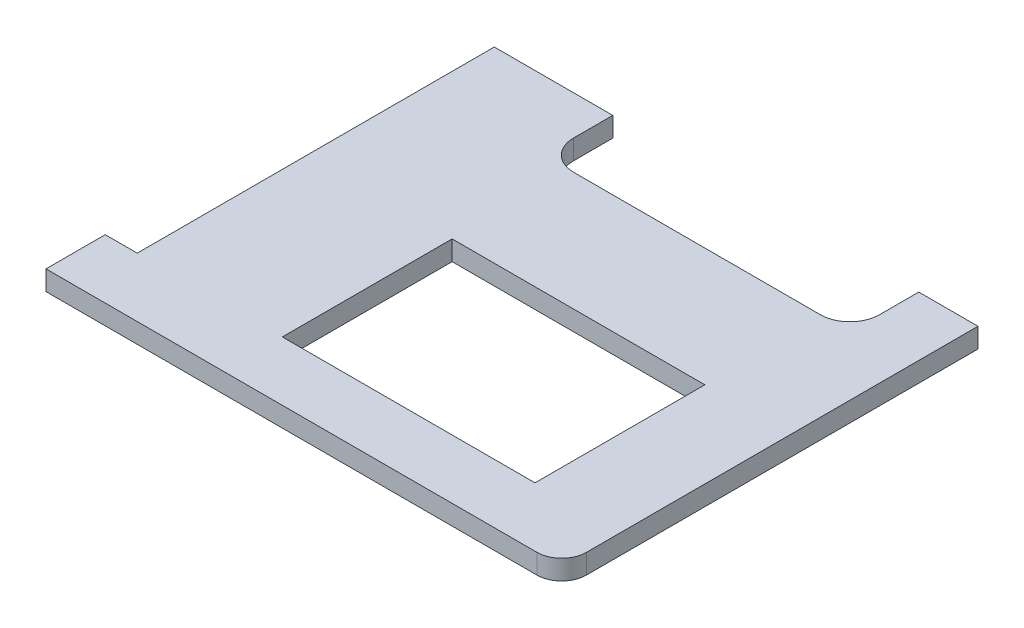
ISO-10303-21;
HEADER;
FILE_DESCRIPTION(('STEP AP214'),'2;1');
FILE_NAME('part.step','',(''),(''),'','','');
FILE_SCHEMA(('AUTOMOTIVE_DESIGN { 1 0 10303 214 1 1 1 1 }'));
ENDSEC;
DATA;
#1=APPLICATION_CONTEXT('core data for automotive mechanical design processes');
#2=APPLICATION_PROTOCOL_DEFINITION('international standard','automotive_design',2000,#1);
#3=PRODUCT_CONTEXT('',#1,'mechanical');
#4=PRODUCT('Part','Part','',(#3));
#5=PRODUCT_RELATED_PRODUCT_CATEGORY('part','',(#4));
#6=PRODUCT_DEFINITION_FORMATION('','',#4);
#7=PRODUCT_DEFINITION_CONTEXT('part definition',#1,'design');
#8=PRODUCT_DEFINITION('design','',#6,#7);
#9=PRODUCT_DEFINITION_SHAPE('','',#8);
#10=(LENGTH_UNIT() NAMED_UNIT(*) SI_UNIT(.MILLI.,.METRE.));
#11=(NAMED_UNIT(*) PLANE_ANGLE_UNIT() SI_UNIT($,.RADIAN.));
#12=(NAMED_UNIT(*) SI_UNIT($,.STERADIAN.) SOLID_ANGLE_UNIT());
#13=UNCERTAINTY_MEASURE_WITH_UNIT(LENGTH_MEASURE(1.E-05),#10,'distance_accuracy_value','');
#14=(GEOMETRIC_REPRESENTATION_CONTEXT(3) GLOBAL_UNCERTAINTY_ASSIGNED_CONTEXT((#13)) GLOBAL_UNIT_ASSIGNED_CONTEXT((#10,
#11,#12)) REPRESENTATION_CONTEXT('',''));
#15=CARTESIAN_POINT('',(0.,0.,0.));
#16=DIRECTION('',(0.,0.,1.));
#17=DIRECTION('',(1.,0.,0.));
#18=AXIS2_PLACEMENT_3D('',#15,#16,#17);
#19=CARTESIAN_POINT('',(95.,10.,-95.));
#20=DIRECTION('',(0.,-1.,0.));
#21=DIRECTION('',(0.,0.,-1.));
#22=AXIS2_PLACEMENT_3D('',#19,#20,#21);
#23=PLANE('',#22);
#24=DIRECTION('',(0.,0.,-1.));
#25=VECTOR('',#24,1.);
#26=CARTESIAN_POINT('',(64.,10.,223.5));
#27=LINE('',#26,#25);
#28=CARTESIAN_POINT('',(64.,10.,223.5));
#29=VERTEX_POINT('',#28);
#30=CARTESIAN_POINT('',(64.,10.,137.5));
#31=VERTEX_POINT('',#30);
#32=EDGE_CURVE('E267',#29,#31,#27,.T.);
#33=ORIENTED_EDGE('',*,*,#32,.F.);
#34=DIRECTION('',(1.,0.,0.));
#35=VECTOR('',#34,1.);
#36=CARTESIAN_POINT('',(-64.,10.,223.5));
#37=LINE('',#36,#35);
#38=CARTESIAN_POINT('',(-64.,10.,223.5));
#39=VERTEX_POINT('',#38);
#40=EDGE_CURVE('E278',#39,#29,#37,.T.);
#41=ORIENTED_EDGE('',*,*,#40,.F.);
#42=DIRECTION('',(0.,0.,1.));
#43=VECTOR('',#42,1.);
#44=CARTESIAN_POINT('',(-64.,10.,223.5));
#45=LINE('',#44,#43);
#46=CARTESIAN_POINT('',(-64.,10.,137.5));
#47=VERTEX_POINT('',#46);
#48=EDGE_CURVE('E274',#47,#39,#45,.T.);
#49=ORIENTED_EDGE('',*,*,#48,.F.);
#50=DIRECTION('',(-1.,0.,0.));
#51=VECTOR('',#50,1.);
#52=CARTESIAN_POINT('',(-64.,10.,137.5));
#53=LINE('',#52,#51);
#54=EDGE_CURVE('E270',#31,#47,#53,.T.);
#55=ORIENTED_EDGE('',*,*,#54,.F.);
#56=EDGE_LOOP('',(#33,#41,#49,#55));
#57=FACE_BOUND('',#56,.T.);
#58=DIRECTION('',(0.,0.,-1.));
#59=VECTOR('',#58,1.);
#60=CARTESIAN_POINT('',(-153.70680706063,10.,253.5));
#61=LINE('',#60,#59);
#62=CARTESIAN_POINT('',(-153.70680706063,10.,253.5));
#63=VERTEX_POINT('',#62);
#64=CARTESIAN_POINT('',(-153.70680706063,10.,223.5));
#65=VERTEX_POINT('',#64);
#66=EDGE_CURVE('E57',#63,#65,#61,.T.);
#67=ORIENTED_EDGE('',*,*,#66,.F.);
#68=DIRECTION('',(1.,0.,0.));
#69=VECTOR('',#68,1.);
#70=CARTESIAN_POINT('',(-221.,10.,253.5));
#71=LINE('',#70,#69);
#72=CARTESIAN_POINT('',(95.,10.,253.5));
#73=VERTEX_POINT('',#72);
#74=EDGE_CURVE('E169',#63,#73,#71,.T.);
#75=ORIENTED_EDGE('',*,*,#74,.T.);
#76=CARTESIAN_POINT('',(95.,10.,241.));
#77=DIRECTION('',(0.,1.,0.));
#78=DIRECTION('',(0.,0.,1.));
#79=AXIS2_PLACEMENT_3D('',#76,#77,#78);
#80=CIRCLE('',#79,12.5);
#81=CARTESIAN_POINT('',(107.5,10.,241.));
#82=VERTEX_POINT('',#81);
#83=EDGE_CURVE('E179',#73,#82,#80,.T.);
#84=ORIENTED_EDGE('',*,*,#83,.T.);
#85=DIRECTION('',(0.,0.,-1.));
#86=VECTOR('',#85,1.);
#87=CARTESIAN_POINT('',(107.5,10.,-95.));
#88=LINE('',#87,#86);
#89=CARTESIAN_POINT('',(107.5,10.,42.6356035302706));
#90=VERTEX_POINT('',#89);
#91=EDGE_CURVE('E184',#82,#90,#88,.T.);
#92=ORIENTED_EDGE('',*,*,#91,.T.);
#93=DIRECTION('',(1.,0.,0.));
#94=VECTOR('',#93,1.);
#95=CARTESIAN_POINT('',(-233.5,10.,42.6356035302706));
#96=LINE('',#95,#94);
#97=CARTESIAN_POINT('',(77.5,10.,42.6356035302706));
#98=VERTEX_POINT('',#97);
#99=EDGE_CURVE('E373',#98,#90,#96,.T.);
#100=ORIENTED_EDGE('',*,*,#99,.F.);
#101=DIRECTION('',(0.,0.,-1.));
#102=VECTOR('',#101,1.);
#103=CARTESIAN_POINT('',(77.5,10.,62.5));
#104=LINE('',#103,#102);
#105=CARTESIAN_POINT('',(77.5,10.,62.5));
#106=VERTEX_POINT('',#105);
#107=EDGE_CURVE('E227',#106,#98,#104,.T.);
#108=ORIENTED_EDGE('',*,*,#107,.F.);
#109=CARTESIAN_POINT('',(62.5,10.,62.5));
#110=DIRECTION('',(0.,1.,0.));
#111=DIRECTION('',(0.,0.,1.));
#112=AXIS2_PLACEMENT_3D('',#109,#110,#111);
#113=CIRCLE('',#112,15.);
#114=CARTESIAN_POINT('',(62.5,10.,77.5));
#115=VERTEX_POINT('',#114);
#116=EDGE_CURVE('E234',#115,#106,#113,.T.);
#117=ORIENTED_EDGE('',*,*,#116,.F.);
#118=DIRECTION('',(1.,0.,0.));
#119=VECTOR('',#118,1.);
#120=CARTESIAN_POINT('',(-62.5,10.,77.5));
#121=LINE('',#120,#119);
#122=CARTESIAN_POINT('',(-62.5,10.,77.5));
#123=VERTEX_POINT('',#122);
#124=EDGE_CURVE('E385',#123,#115,#121,.T.);
#125=ORIENTED_EDGE('',*,*,#124,.F.);
#126=CARTESIAN_POINT('',(-62.5,10.,62.5));
#127=DIRECTION('',(0.,1.,0.));
#128=DIRECTION('',(0.,0.,-1.));
#129=AXIS2_PLACEMENT_3D('',#126,#127,#128);
#130=CIRCLE('',#129,15.);
#131=CARTESIAN_POINT('',(-77.5,10.,62.5));
#132=VERTEX_POINT('',#131);
#133=EDGE_CURVE('E224',#132,#123,#130,.T.);
#134=ORIENTED_EDGE('',*,*,#133,.F.);
#135=DIRECTION('',(0.,0.,1.));
#136=VECTOR('',#135,1.);
#137=CARTESIAN_POINT('',(-77.5,10.,62.5));
#138=LINE('',#137,#136);
#139=CARTESIAN_POINT('',(-77.5,10.,42.6356035302706));
#140=VERTEX_POINT('',#139);
#141=EDGE_CURVE('E214',#140,#132,#138,.T.);
#142=ORIENTED_EDGE('',*,*,#141,.F.);
#143=CARTESIAN_POINT('',(-137.5,10.,42.6356035302706));
#144=VERTEX_POINT('',#143);
#145=EDGE_CURVE('E221',#144,#140,#96,.T.);
#146=ORIENTED_EDGE('',*,*,#145,.F.);
#147=DIRECTION('',(0.,0.,-1.));
#148=VECTOR('',#147,1.);
#149=CARTESIAN_POINT('',(-137.5,10.,223.5));
#150=LINE('',#149,#148);
#151=CARTESIAN_POINT('',(-137.5,10.,223.5));
#152=VERTEX_POINT('',#151);
#153=EDGE_CURVE('E309',#152,#144,#150,.T.);
#154=ORIENTED_EDGE('',*,*,#153,.F.);
#155=DIRECTION('',(1.,0.,0.));
#156=VECTOR('',#155,1.);
#157=CARTESIAN_POINT('',(-203.5,10.,223.5));
#158=LINE('',#157,#156);
#159=EDGE_CURVE('E172',#65,#152,#158,.T.);
#160=ORIENTED_EDGE('',*,*,#159,.F.);
#161=EDGE_LOOP('',(#67,#75,#84,#92,#100,#108,#117,#125,#134,#142,#146,#154,#160));
#162=FACE_BOUND('',#161,.T.);
#163=ADVANCED_FACE('F41',(#57,#162),#23,.F.);
#164=CARTESIAN_POINT('',(95.,0.,-95.));
#165=DIRECTION('',(0.,-1.,0.));
#166=DIRECTION('',(0.,0.,-1.));
#167=AXIS2_PLACEMENT_3D('',#164,#165,#166);
#168=PLANE('',#167);
#169=DIRECTION('',(1.,0.,0.));
#170=VECTOR('',#169,1.);
#171=CARTESIAN_POINT('',(-64.,0.,223.5));
#172=LINE('',#171,#170);
#173=CARTESIAN_POINT('',(-64.,0.,223.5));
#174=VERTEX_POINT('',#173);
#175=CARTESIAN_POINT('',(64.,0.,223.5));
#176=VERTEX_POINT('',#175);
#177=EDGE_CURVE('E271',#174,#176,#172,.T.);
#178=ORIENTED_EDGE('',*,*,#177,.T.);
#179=DIRECTION('',(0.,0.,-1.));
#180=VECTOR('',#179,1.);
#181=CARTESIAN_POINT('',(64.,0.,223.5));
#182=LINE('',#181,#180);
#183=CARTESIAN_POINT('',(64.,0.,137.5));
#184=VERTEX_POINT('',#183);
#185=EDGE_CURVE('E282',#176,#184,#182,.T.);
#186=ORIENTED_EDGE('',*,*,#185,.T.);
#187=DIRECTION('',(-1.,0.,0.));
#188=VECTOR('',#187,1.);
#189=CARTESIAN_POINT('',(-64.,0.,137.5));
#190=LINE('',#189,#188);
#191=CARTESIAN_POINT('',(-64.,0.,137.5));
#192=VERTEX_POINT('',#191);
#193=EDGE_CURVE('E286',#184,#192,#190,.T.);
#194=ORIENTED_EDGE('',*,*,#193,.T.);
#195=DIRECTION('',(0.,0.,1.));
#196=VECTOR('',#195,1.);
#197=CARTESIAN_POINT('',(-64.,0.,223.5));
#198=LINE('',#197,#196);
#199=EDGE_CURVE('E290',#192,#174,#198,.T.);
#200=ORIENTED_EDGE('',*,*,#199,.T.);
#201=EDGE_LOOP('',(#178,#186,#194,#200));
#202=FACE_BOUND('',#201,.T.);
#203=DIRECTION('',(1.,0.,0.));
#204=VECTOR('',#203,1.);
#205=CARTESIAN_POINT('',(-221.,0.,253.5));
#206=LINE('',#205,#204);
#207=CARTESIAN_POINT('',(-153.70680706063,0.,253.5));
#208=VERTEX_POINT('',#207);
#209=CARTESIAN_POINT('',(95.,0.,253.5));
#210=VERTEX_POINT('',#209);
#211=EDGE_CURVE('E197',#208,#210,#206,.T.);
#212=ORIENTED_EDGE('',*,*,#211,.F.);
#213=DIRECTION('',(0.,0.,-1.));
#214=VECTOR('',#213,1.);
#215=CARTESIAN_POINT('',(-153.70680706063,0.,253.5));
#216=LINE('',#215,#214);
#217=CARTESIAN_POINT('',(-153.70680706063,0.,223.5));
#218=VERTEX_POINT('',#217);
#219=EDGE_CURVE('E161',#208,#218,#216,.T.);
#220=ORIENTED_EDGE('',*,*,#219,.T.);
#221=DIRECTION('',(1.,0.,0.));
#222=VECTOR('',#221,1.);
#223=CARTESIAN_POINT('',(-203.5,0.,223.5));
#224=LINE('',#223,#222);
#225=CARTESIAN_POINT('',(-137.5,0.,223.5));
#226=VERTEX_POINT('',#225);
#227=EDGE_CURVE('E312',#218,#226,#224,.T.);
#228=ORIENTED_EDGE('',*,*,#227,.T.);
#229=DIRECTION('',(0.,0.,-1.));
#230=VECTOR('',#229,1.);
#231=CARTESIAN_POINT('',(-137.5,0.,223.5));
#232=LINE('',#231,#230);
#233=CARTESIAN_POINT('',(-137.5,0.,42.6356035302706));
#234=VERTEX_POINT('',#233);
#235=EDGE_CURVE('E266',#226,#234,#232,.T.);
#236=ORIENTED_EDGE('',*,*,#235,.T.);
#237=DIRECTION('',(1.,0.,0.));
#238=VECTOR('',#237,1.);
#239=CARTESIAN_POINT('',(-233.5,0.,42.6356035302706));
#240=LINE('',#239,#238);
#241=CARTESIAN_POINT('',(-77.5,0.,42.6356035302706));
#242=VERTEX_POINT('',#241);
#243=EDGE_CURVE('E370',#234,#242,#240,.T.);
#244=ORIENTED_EDGE('',*,*,#243,.T.);
#245=DIRECTION('',(0.,0.,1.));
#246=VECTOR('',#245,1.);
#247=CARTESIAN_POINT('',(-77.5,0.,62.5));
#248=LINE('',#247,#246);
#249=CARTESIAN_POINT('',(-77.5,0.,62.5));
#250=VERTEX_POINT('',#249);
#251=EDGE_CURVE('E216',#242,#250,#248,.T.);
#252=ORIENTED_EDGE('',*,*,#251,.T.);
#253=CARTESIAN_POINT('',(-62.5,0.,62.5));
#254=DIRECTION('',(0.,1.,0.));
#255=DIRECTION('',(0.,0.,-1.));
#256=AXIS2_PLACEMENT_3D('',#253,#254,#255);
#257=CIRCLE('',#256,15.);
#258=CARTESIAN_POINT('',(-62.5,0.,77.5));
#259=VERTEX_POINT('',#258);
#260=EDGE_CURVE('E238',#250,#259,#257,.T.);
#261=ORIENTED_EDGE('',*,*,#260,.T.);
#262=DIRECTION('',(1.,0.,0.));
#263=VECTOR('',#262,1.);
#264=CARTESIAN_POINT('',(-62.5,0.,77.5));
#265=LINE('',#264,#263);
#266=CARTESIAN_POINT('',(62.5,0.,77.5));
#267=VERTEX_POINT('',#266);
#268=EDGE_CURVE('E242',#259,#267,#265,.T.);
#269=ORIENTED_EDGE('',*,*,#268,.T.);
#270=CARTESIAN_POINT('',(62.5,0.,62.5));
#271=DIRECTION('',(0.,1.,0.));
#272=DIRECTION('',(0.,0.,1.));
#273=AXIS2_PLACEMENT_3D('',#270,#271,#272);
#274=CIRCLE('',#273,15.);
#275=CARTESIAN_POINT('',(77.5,0.,62.5));
#276=VERTEX_POINT('',#275);
#277=EDGE_CURVE('E247',#267,#276,#274,.T.);
#278=ORIENTED_EDGE('',*,*,#277,.T.);
#279=DIRECTION('',(0.,0.,-1.));
#280=VECTOR('',#279,1.);
#281=CARTESIAN_POINT('',(77.5,0.,62.5));
#282=LINE('',#281,#280);
#283=CARTESIAN_POINT('',(77.5,0.,42.6356035302706));
#284=VERTEX_POINT('',#283);
#285=EDGE_CURVE('E251',#276,#284,#282,.T.);
#286=ORIENTED_EDGE('',*,*,#285,.T.);
#287=CARTESIAN_POINT('',(107.5,0.,42.6356035302706));
#288=VERTEX_POINT('',#287);
#289=EDGE_CURVE('E64',#284,#288,#240,.T.);
#290=ORIENTED_EDGE('',*,*,#289,.T.);
#291=DIRECTION('',(0.,0.,-1.));
#292=VECTOR('',#291,1.);
#293=CARTESIAN_POINT('',(107.5,0.,-95.));
#294=LINE('',#293,#292);
#295=CARTESIAN_POINT('',(107.5,0.,241.));
#296=VERTEX_POINT('',#295);
#297=EDGE_CURVE('E180',#296,#288,#294,.T.);
#298=ORIENTED_EDGE('',*,*,#297,.F.);
#299=CARTESIAN_POINT('',(95.,0.,241.));
#300=DIRECTION('',(0.,1.,0.));
#301=DIRECTION('',(0.,0.,1.));
#302=AXIS2_PLACEMENT_3D('',#299,#300,#301);
#303=CIRCLE('',#302,12.5);
#304=EDGE_CURVE('E187',#210,#296,#303,.T.);
#305=ORIENTED_EDGE('',*,*,#304,.F.);
#306=EDGE_LOOP('',(#212,#220,#228,#236,#244,#252,#261,#269,#278,#286,#290,#298,#305));
#307=FACE_BOUND('',#306,.T.);
#308=ADVANCED_FACE('F321',(#202,#307),#168,.T.);
#309=CARTESIAN_POINT('',(-221.,10.,253.5));
#310=DIRECTION('',(0.,0.,-1.));
#311=DIRECTION('',(-1.,0.,0.));
#312=AXIS2_PLACEMENT_3D('',#309,#310,#311);
#313=PLANE('',#312);
#314=DIRECTION('',(0.,-1.,0.));
#315=VECTOR('',#314,1.);
#316=CARTESIAN_POINT('',(-153.70680706063,10.,253.5));
#317=LINE('',#316,#315);
#318=EDGE_CURVE('E158',#63,#208,#317,.T.);
#319=ORIENTED_EDGE('',*,*,#318,.T.);
#320=ORIENTED_EDGE('',*,*,#211,.T.);
#321=DIRECTION('',(0.,-1.,0.));
#322=VECTOR('',#321,1.);
#323=CARTESIAN_POINT('',(95.,10.,253.5));
#324=LINE('',#323,#322);
#325=EDGE_CURVE('E176',#73,#210,#324,.T.);
#326=ORIENTED_EDGE('',*,*,#325,.F.);
#327=ORIENTED_EDGE('',*,*,#74,.F.);
#328=EDGE_LOOP('',(#319,#320,#326,#327));
#329=FACE_BOUND('',#328,.T.);
#330=ADVANCED_FACE('F43',(#329),#313,.F.);
#331=CARTESIAN_POINT('',(-203.5,10.,223.5));
#332=DIRECTION('',(0.,0.,-1.));
#333=DIRECTION('',(-1.,0.,0.));
#334=AXIS2_PLACEMENT_3D('',#331,#332,#333);
#335=PLANE('',#334);
#336=ORIENTED_EDGE('',*,*,#227,.F.);
#337=DIRECTION('',(0.,1.,0.));
#338=VECTOR('',#337,1.);
#339=CARTESIAN_POINT('',(-153.70680706063,10.,223.5));
#340=LINE('',#339,#338);
#341=EDGE_CURVE('E11',#218,#65,#340,.T.);
#342=ORIENTED_EDGE('',*,*,#341,.T.);
#343=ORIENTED_EDGE('',*,*,#159,.T.);
#344=DIRECTION('',(0.,-1.,0.));
#345=VECTOR('',#344,1.);
#346=CARTESIAN_POINT('',(-137.5,10.,223.5));
#347=LINE('',#346,#345);
#348=EDGE_CURVE('E190',#152,#226,#347,.T.);
#349=ORIENTED_EDGE('',*,*,#348,.T.);
#350=EDGE_LOOP('',(#336,#342,#343,#349));
#351=FACE_BOUND('',#350,.T.);
#352=ADVANCED_FACE('F329',(#351),#335,.T.);
#353=CARTESIAN_POINT('',(107.5,10.,-95.));
#354=DIRECTION('',(-1.,0.,0.));
#355=DIRECTION('',(0.,0.,1.));
#356=AXIS2_PLACEMENT_3D('',#353,#354,#355);
#357=PLANE('',#356);
#358=DIRECTION('',(0.,-1.,0.));
#359=VECTOR('',#358,1.);
#360=CARTESIAN_POINT('',(107.5,10.,42.6356035302706));
#361=LINE('',#360,#359);
#362=EDGE_CURVE('E243',#90,#288,#361,.T.);
#363=ORIENTED_EDGE('',*,*,#362,.F.);
#364=ORIENTED_EDGE('',*,*,#91,.F.);
#365=DIRECTION('',(0.,-1.,0.));
#366=VECTOR('',#365,1.);
#367=CARTESIAN_POINT('',(107.5,10.,241.));
#368=LINE('',#367,#366);
#369=EDGE_CURVE('E196',#82,#296,#368,.T.);
#370=ORIENTED_EDGE('',*,*,#369,.T.);
#371=ORIENTED_EDGE('',*,*,#297,.T.);
#372=EDGE_LOOP('',(#363,#364,#370,#371));
#373=FACE_BOUND('',#372,.T.);
#374=ADVANCED_FACE('F332',(#373),#357,.F.);
#375=CARTESIAN_POINT('',(-137.5,10.,223.5));
#376=DIRECTION('',(-1.,0.,0.));
#377=DIRECTION('',(0.,0.,1.));
#378=AXIS2_PLACEMENT_3D('',#375,#376,#377);
#379=PLANE('',#378);
#380=ORIENTED_EDGE('',*,*,#153,.T.);
#381=DIRECTION('',(0.,-1.,0.));
#382=VECTOR('',#381,1.);
#383=CARTESIAN_POINT('',(-137.5,10.,42.6356035302706));
#384=LINE('',#383,#382);
#385=EDGE_CURVE('E328',#144,#234,#384,.T.);
#386=ORIENTED_EDGE('',*,*,#385,.T.);
#387=ORIENTED_EDGE('',*,*,#235,.F.);
#388=ORIENTED_EDGE('',*,*,#348,.F.);
#389=EDGE_LOOP('',(#380,#386,#387,#388));
#390=FACE_BOUND('',#389,.T.);
#391=ADVANCED_FACE('F327',(#390),#379,.T.);
#392=CARTESIAN_POINT('',(77.5,10.,62.5));
#393=DIRECTION('',(-1.,0.,0.));
#394=DIRECTION('',(0.,0.,1.));
#395=AXIS2_PLACEMENT_3D('',#392,#393,#394);
#396=PLANE('',#395);
#397=ORIENTED_EDGE('',*,*,#107,.T.);
#398=DIRECTION('',(0.,-1.,0.));
#399=VECTOR('',#398,1.);
#400=CARTESIAN_POINT('',(77.5,10.,42.6356035302706));
#401=LINE('',#400,#399);
#402=EDGE_CURVE('E376',#98,#284,#401,.T.);
#403=ORIENTED_EDGE('',*,*,#402,.T.);
#404=ORIENTED_EDGE('',*,*,#285,.F.);
#405=DIRECTION('',(0.,-1.,0.));
#406=VECTOR('',#405,1.);
#407=CARTESIAN_POINT('',(77.5,10.,62.5));
#408=LINE('',#407,#406);
#409=EDGE_CURVE('E231',#106,#276,#408,.T.);
#410=ORIENTED_EDGE('',*,*,#409,.F.);
#411=EDGE_LOOP('',(#397,#403,#404,#410));
#412=FACE_BOUND('',#411,.T.);
#413=ADVANCED_FACE('F361',(#412),#396,.T.);
#414=CARTESIAN_POINT('',(-77.5,10.,62.5));
#415=DIRECTION('',(1.,0.,0.));
#416=DIRECTION('',(0.,0.,-1.));
#417=AXIS2_PLACEMENT_3D('',#414,#415,#416);
#418=PLANE('',#417);
#419=ORIENTED_EDGE('',*,*,#251,.F.);
#420=DIRECTION('',(0.,1.,0.));
#421=VECTOR('',#420,1.);
#422=CARTESIAN_POINT('',(-77.5,10.,42.6356035302706));
#423=LINE('',#422,#421);
#424=EDGE_CURVE('E50',#242,#140,#423,.T.);
#425=ORIENTED_EDGE('',*,*,#424,.T.);
#426=ORIENTED_EDGE('',*,*,#141,.T.);
#427=DIRECTION('',(0.,-1.,0.));
#428=VECTOR('',#427,1.);
#429=CARTESIAN_POINT('',(-77.5,10.,62.5));
#430=LINE('',#429,#428);
#431=EDGE_CURVE('E226',#132,#250,#430,.T.);
#432=ORIENTED_EDGE('',*,*,#431,.T.);
#433=EDGE_LOOP('',(#419,#425,#426,#432));
#434=FACE_BOUND('',#433,.T.);
#435=ADVANCED_FACE('F212',(#434),#418,.T.);
#436=CARTESIAN_POINT('',(95.,10.,241.));
#437=DIRECTION('',(0.,-1.,0.));
#438=DIRECTION('',(0.,0.,-1.));
#439=AXIS2_PLACEMENT_3D('',#436,#437,#438);
#440=CYLINDRICAL_SURFACE('',#439,12.5);
#441=ORIENTED_EDGE('',*,*,#304,.T.);
#442=ORIENTED_EDGE('',*,*,#369,.F.);
#443=ORIENTED_EDGE('',*,*,#83,.F.);
#444=ORIENTED_EDGE('',*,*,#325,.T.);
#445=EDGE_LOOP('',(#441,#442,#443,#444));
#446=FACE_BOUND('',#445,.T.);
#447=ADVANCED_FACE('F351',(#446),#440,.T.);
#448=CARTESIAN_POINT('',(64.,10.,223.5));
#449=DIRECTION('',(-1.,0.,0.));
#450=DIRECTION('',(0.,0.,1.));
#451=AXIS2_PLACEMENT_3D('',#448,#449,#450);
#452=PLANE('',#451);
#453=ORIENTED_EDGE('',*,*,#185,.F.);
#454=DIRECTION('',(0.,-1.,0.));
#455=VECTOR('',#454,1.);
#456=CARTESIAN_POINT('',(64.,10.,223.5));
#457=LINE('',#456,#455);
#458=EDGE_CURVE('E281',#29,#176,#457,.T.);
#459=ORIENTED_EDGE('',*,*,#458,.F.);
#460=ORIENTED_EDGE('',*,*,#32,.T.);
#461=DIRECTION('',(0.,-1.,0.));
#462=VECTOR('',#461,1.);
#463=CARTESIAN_POINT('',(64.,10.,137.5));
#464=LINE('',#463,#462);
#465=EDGE_CURVE('E200',#31,#184,#464,.T.);
#466=ORIENTED_EDGE('',*,*,#465,.T.);
#467=EDGE_LOOP('',(#453,#459,#460,#466));
#468=FACE_BOUND('',#467,.T.);
#469=ADVANCED_FACE('F353',(#468),#452,.T.);
#470=CARTESIAN_POINT('',(-64.,10.,137.5));
#471=DIRECTION('',(0.,0.,1.));
#472=DIRECTION('',(1.,0.,0.));
#473=AXIS2_PLACEMENT_3D('',#470,#471,#472);
#474=PLANE('',#473);
#475=ORIENTED_EDGE('',*,*,#193,.F.);
#476=ORIENTED_EDGE('',*,*,#465,.F.);
#477=ORIENTED_EDGE('',*,*,#54,.T.);
#478=DIRECTION('',(0.,-1.,0.));
#479=VECTOR('',#478,1.);
#480=CARTESIAN_POINT('',(-64.,10.,137.5));
#481=LINE('',#480,#479);
#482=EDGE_CURVE('E303',#47,#192,#481,.T.);
#483=ORIENTED_EDGE('',*,*,#482,.T.);
#484=EDGE_LOOP('',(#475,#476,#477,#483));
#485=FACE_BOUND('',#484,.T.);
#486=ADVANCED_FACE('F359',(#485),#474,.T.);
#487=CARTESIAN_POINT('',(-64.,10.,223.5));
#488=DIRECTION('',(1.,0.,0.));
#489=DIRECTION('',(0.,0.,-1.));
#490=AXIS2_PLACEMENT_3D('',#487,#488,#489);
#491=PLANE('',#490);
#492=ORIENTED_EDGE('',*,*,#199,.F.);
#493=ORIENTED_EDGE('',*,*,#482,.F.);
#494=ORIENTED_EDGE('',*,*,#48,.T.);
#495=DIRECTION('',(0.,-1.,0.));
#496=VECTOR('',#495,1.);
#497=CARTESIAN_POINT('',(-64.,10.,223.5));
#498=LINE('',#497,#496);
#499=EDGE_CURVE('E300',#39,#174,#498,.T.);
#500=ORIENTED_EDGE('',*,*,#499,.T.);
#501=EDGE_LOOP('',(#492,#493,#494,#500));
#502=FACE_BOUND('',#501,.T.);
#503=ADVANCED_FACE('F419',(#502),#491,.T.);
#504=CARTESIAN_POINT('',(-64.,10.,223.5));
#505=DIRECTION('',(0.,0.,-1.));
#506=DIRECTION('',(-1.,0.,0.));
#507=AXIS2_PLACEMENT_3D('',#504,#505,#506);
#508=PLANE('',#507);
#509=ORIENTED_EDGE('',*,*,#177,.F.);
#510=ORIENTED_EDGE('',*,*,#499,.F.);
#511=ORIENTED_EDGE('',*,*,#40,.T.);
#512=ORIENTED_EDGE('',*,*,#458,.T.);
#513=EDGE_LOOP('',(#509,#510,#511,#512));
#514=FACE_BOUND('',#513,.T.);
#515=ADVANCED_FACE('F413',(#514),#508,.T.);
#516=CARTESIAN_POINT('',(-62.5,10.,62.5));
#517=DIRECTION('',(0.,-1.,0.));
#518=DIRECTION('',(0.,0.,-1.));
#519=AXIS2_PLACEMENT_3D('',#516,#517,#518);
#520=CYLINDRICAL_SURFACE('',#519,15.);
#521=ORIENTED_EDGE('',*,*,#260,.F.);
#522=ORIENTED_EDGE('',*,*,#431,.F.);
#523=ORIENTED_EDGE('',*,*,#133,.T.);
#524=DIRECTION('',(0.,-1.,0.));
#525=VECTOR('',#524,1.);
#526=CARTESIAN_POINT('',(-62.5,10.,77.5));
#527=LINE('',#526,#525);
#528=EDGE_CURVE('E262',#123,#259,#527,.T.);
#529=ORIENTED_EDGE('',*,*,#528,.T.);
#530=EDGE_LOOP('',(#521,#522,#523,#529));
#531=FACE_BOUND('',#530,.T.);
#532=ADVANCED_FACE('F402',(#531),#520,.F.);
#533=CARTESIAN_POINT('',(-62.5,10.,77.5));
#534=DIRECTION('',(0.,0.,-1.));
#535=DIRECTION('',(-1.,0.,0.));
#536=AXIS2_PLACEMENT_3D('',#533,#534,#535);
#537=PLANE('',#536);
#538=ORIENTED_EDGE('',*,*,#268,.F.);
#539=ORIENTED_EDGE('',*,*,#528,.F.);
#540=ORIENTED_EDGE('',*,*,#124,.T.);
#541=DIRECTION('',(0.,-1.,0.));
#542=VECTOR('',#541,1.);
#543=CARTESIAN_POINT('',(62.5,10.,77.5));
#544=LINE('',#543,#542);
#545=EDGE_CURVE('E259',#115,#267,#544,.T.);
#546=ORIENTED_EDGE('',*,*,#545,.T.);
#547=EDGE_LOOP('',(#538,#539,#540,#546));
#548=FACE_BOUND('',#547,.T.);
#549=ADVANCED_FACE('F405',(#548),#537,.T.);
#550=CARTESIAN_POINT('',(62.5,10.,62.5));
#551=DIRECTION('',(0.,-1.,0.));
#552=DIRECTION('',(0.,0.,-1.));
#553=AXIS2_PLACEMENT_3D('',#550,#551,#552);
#554=CYLINDRICAL_SURFACE('',#553,15.);
#555=ORIENTED_EDGE('',*,*,#277,.F.);
#556=ORIENTED_EDGE('',*,*,#545,.F.);
#557=ORIENTED_EDGE('',*,*,#116,.T.);
#558=ORIENTED_EDGE('',*,*,#409,.T.);
#559=EDGE_LOOP('',(#555,#556,#557,#558));
#560=FACE_BOUND('',#559,.T.);
#561=ADVANCED_FACE('F393',(#560),#554,.F.);
#562=CARTESIAN_POINT('',(-233.5,10.,42.6356035302706));
#563=DIRECTION('',(0.,0.,-1.));
#564=DIRECTION('',(-1.,0.,0.));
#565=AXIS2_PLACEMENT_3D('',#562,#563,#564);
#566=PLANE('',#565);
#567=ORIENTED_EDGE('',*,*,#145,.T.);
#568=ORIENTED_EDGE('',*,*,#424,.F.);
#569=ORIENTED_EDGE('',*,*,#243,.F.);
#570=ORIENTED_EDGE('',*,*,#385,.F.);
#571=EDGE_LOOP('',(#567,#568,#569,#570));
#572=FACE_BOUND('',#571,.T.);
#573=ADVANCED_FACE('F399',(#572),#566,.T.);
#574=ORIENTED_EDGE('',*,*,#362,.T.);
#575=ORIENTED_EDGE('',*,*,#289,.F.);
#576=ORIENTED_EDGE('',*,*,#402,.F.);
#577=ORIENTED_EDGE('',*,*,#99,.T.);
#578=EDGE_LOOP('',(#574,#575,#576,#577));
#579=FACE_BOUND('',#578,.T.);
#580=ADVANCED_FACE('F495',(#579),#566,.T.);
#581=CARTESIAN_POINT('',(-153.70680706063,10.,253.5));
#582=DIRECTION('',(-1.,0.,0.));
#583=DIRECTION('',(0.,0.,1.));
#584=AXIS2_PLACEMENT_3D('',#581,#582,#583);
#585=PLANE('',#584);
#586=ORIENTED_EDGE('',*,*,#219,.F.);
#587=ORIENTED_EDGE('',*,*,#318,.F.);
#588=ORIENTED_EDGE('',*,*,#66,.T.);
#589=ORIENTED_EDGE('',*,*,#341,.F.);
#590=EDGE_LOOP('',(#586,#587,#588,#589));
#591=FACE_BOUND('',#590,.T.);
#592=ADVANCED_FACE('F159',(#591),#585,.T.);
#593=CLOSED_SHELL('',(#163,#308,#330,#352,#374,#391,#413,#435,#447,#469,#486,#503,#515,#532,
#549,#561,#573,#580,#592));
#594=MANIFOLD_SOLID_BREP('B2',#593);
#595=ADVANCED_BREP_SHAPE_REPRESENTATION('',(#18,#594),#14);
#596=SHAPE_DEFINITION_REPRESENTATION(#9,#595);
ENDSEC;
END-ISO-10303-21;
